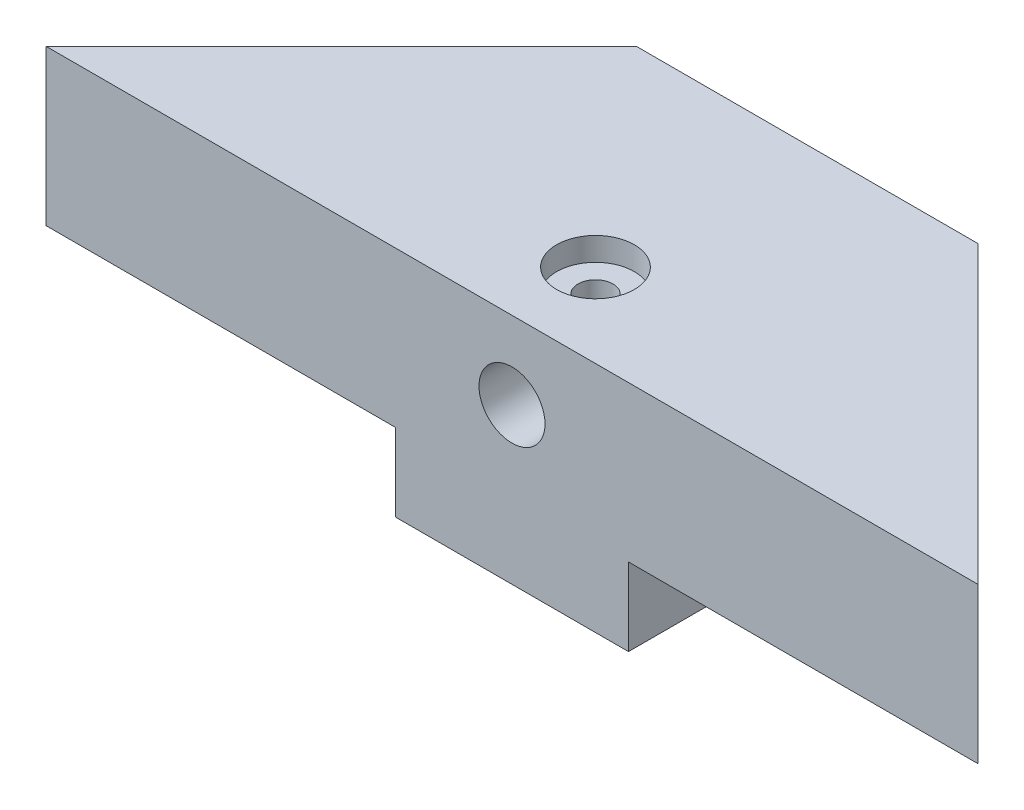
ISO-10303-21;
HEADER;
FILE_DESCRIPTION(('STEP AP214'),'2;1');
FILE_NAME('part.step','',(''),(''),'','','');
FILE_SCHEMA(('AUTOMOTIVE_DESIGN { 1 0 10303 214 1 1 1 1 }'));
ENDSEC;
DATA;
#1=APPLICATION_CONTEXT('core data for automotive mechanical design processes');
#2=APPLICATION_PROTOCOL_DEFINITION('international standard','automotive_design',2000,#1);
#3=PRODUCT_CONTEXT('',#1,'mechanical');
#4=PRODUCT('Part','Part','',(#3));
#5=PRODUCT_RELATED_PRODUCT_CATEGORY('part','',(#4));
#6=PRODUCT_DEFINITION_FORMATION('','',#4);
#7=PRODUCT_DEFINITION_CONTEXT('part definition',#1,'design');
#8=PRODUCT_DEFINITION('design','',#6,#7);
#9=PRODUCT_DEFINITION_SHAPE('','',#8);
#10=(LENGTH_UNIT() NAMED_UNIT(*) SI_UNIT(.MILLI.,.METRE.));
#11=(NAMED_UNIT(*) PLANE_ANGLE_UNIT() SI_UNIT($,.RADIAN.));
#12=(NAMED_UNIT(*) SI_UNIT($,.STERADIAN.) SOLID_ANGLE_UNIT());
#13=UNCERTAINTY_MEASURE_WITH_UNIT(LENGTH_MEASURE(1.E-05),#10,'distance_accuracy_value','');
#14=(GEOMETRIC_REPRESENTATION_CONTEXT(3) GLOBAL_UNCERTAINTY_ASSIGNED_CONTEXT((#13)) GLOBAL_UNIT_ASSIGNED_CONTEXT((#10,
#11,#12)) REPRESENTATION_CONTEXT('',''));
#15=CARTESIAN_POINT('',(0.,0.,0.));
#16=DIRECTION('',(0.,0.,1.));
#17=DIRECTION('',(1.,0.,0.));
#18=AXIS2_PLACEMENT_3D('',#15,#16,#17);
#19=CARTESIAN_POINT('',(0.,20.,0.));
#20=DIRECTION('',(0.,0.,-1.));
#21=DIRECTION('',(-1.,0.,0.));
#22=AXIS2_PLACEMENT_3D('',#19,#20,#21);
#23=PLANE('',#22);
#24=CARTESIAN_POINT('',(0.,10.,0.));
#25=DIRECTION('',(0.,0.,1.));
#26=DIRECTION('',(1.,0.,0.));
#27=AXIS2_PLACEMENT_3D('',#24,#25,#26);
#28=CIRCLE('',#27,4.25);
#29=CARTESIAN_POINT('',(4.25,10.,0.));
#30=VERTEX_POINT('',#29);
#31=EDGE_CURVE('E140',#30,#30,#28,.T.);
#32=ORIENTED_EDGE('',*,*,#31,.F.);
#33=EDGE_LOOP('',(#32));
#34=FACE_BOUND('',#33,.T.);
#35=DIRECTION('',(1.,0.,0.));
#36=VECTOR('',#35,1.);
#37=CARTESIAN_POINT('',(0.,0.,0.));
#38=LINE('',#37,#36);
#39=CARTESIAN_POINT('',(-60.,0.,0.));
#40=VERTEX_POINT('',#39);
#41=CARTESIAN_POINT('',(-15.,0.,0.));
#42=VERTEX_POINT('',#41);
#43=EDGE_CURVE('E164',#40,#42,#38,.T.);
#44=ORIENTED_EDGE('',*,*,#43,.T.);
#45=DIRECTION('',(0.,1.,0.));
#46=VECTOR('',#45,1.);
#47=CARTESIAN_POINT('',(-15.,-10.,0.));
#48=LINE('',#47,#46);
#49=CARTESIAN_POINT('',(-15.,-10.,0.));
#50=VERTEX_POINT('',#49);
#51=EDGE_CURVE('E213',#50,#42,#48,.T.);
#52=ORIENTED_EDGE('',*,*,#51,.F.);
#53=DIRECTION('',(-1.,0.,0.));
#54=VECTOR('',#53,1.);
#55=CARTESIAN_POINT('',(0.,-10.,0.));
#56=LINE('',#55,#54);
#57=CARTESIAN_POINT('',(15.,-10.,0.));
#58=VERTEX_POINT('',#57);
#59=EDGE_CURVE('E129',#58,#50,#56,.T.);
#60=ORIENTED_EDGE('',*,*,#59,.F.);
#61=DIRECTION('',(0.,1.,0.));
#62=VECTOR('',#61,1.);
#63=CARTESIAN_POINT('',(15.,-10.,0.));
#64=LINE('',#63,#62);
#65=CARTESIAN_POINT('',(15.,0.,0.));
#66=VERTEX_POINT('',#65);
#67=EDGE_CURVE('E142',#58,#66,#64,.T.);
#68=ORIENTED_EDGE('',*,*,#67,.T.);
#69=CARTESIAN_POINT('',(60.,0.,0.));
#70=VERTEX_POINT('',#69);
#71=EDGE_CURVE('E69',#66,#70,#38,.T.);
#72=ORIENTED_EDGE('',*,*,#71,.T.);
#73=DIRECTION('',(0.,-1.,0.));
#74=VECTOR('',#73,1.);
#75=CARTESIAN_POINT('',(60.,20.,0.));
#76=LINE('',#75,#74);
#77=CARTESIAN_POINT('',(60.,20.,0.));
#78=VERTEX_POINT('',#77);
#79=EDGE_CURVE('E11',#78,#70,#76,.T.);
#80=ORIENTED_EDGE('',*,*,#79,.F.);
#81=DIRECTION('',(1.,0.,0.));
#82=VECTOR('',#81,1.);
#83=CARTESIAN_POINT('',(0.,20.,0.));
#84=LINE('',#83,#82);
#85=CARTESIAN_POINT('',(-60.,20.,0.));
#86=VERTEX_POINT('',#85);
#87=EDGE_CURVE('E154',#86,#78,#84,.T.);
#88=ORIENTED_EDGE('',*,*,#87,.F.);
#89=DIRECTION('',(0.,-1.,0.));
#90=VECTOR('',#89,1.);
#91=CARTESIAN_POINT('',(-60.,20.,0.));
#92=LINE('',#91,#90);
#93=EDGE_CURVE('E163',#86,#40,#92,.T.);
#94=ORIENTED_EDGE('',*,*,#93,.T.);
#95=EDGE_LOOP('',(#44,#52,#60,#68,#72,#80,#88,#94));
#96=FACE_BOUND('',#95,.T.);
#97=ADVANCED_FACE('F43',(#34,#96),#23,.F.);
#98=CARTESIAN_POINT('',(22.,20.,-38.));
#99=DIRECTION('',(-0.707106781186548,0.,0.707106781186548));
#100=DIRECTION('',(0.707106781186548,0.,0.707106781186548));
#101=AXIS2_PLACEMENT_3D('',#98,#99,#100);
#102=PLANE('',#101);
#103=DIRECTION('',(-0.707106781186548,0.,-0.707106781186548));
#104=VECTOR('',#103,1.);
#105=CARTESIAN_POINT('',(22.,0.,-38.));
#106=LINE('',#105,#104);
#107=CARTESIAN_POINT('',(22.,0.,-38.));
#108=VERTEX_POINT('',#107);
#109=EDGE_CURVE('E169',#70,#108,#106,.T.);
#110=ORIENTED_EDGE('',*,*,#109,.T.);
#111=DIRECTION('',(0.,-1.,0.));
#112=VECTOR('',#111,1.);
#113=CARTESIAN_POINT('',(22.,20.,-38.));
#114=LINE('',#113,#112);
#115=CARTESIAN_POINT('',(22.,20.,-38.));
#116=VERTEX_POINT('',#115);
#117=EDGE_CURVE('E57',#116,#108,#114,.T.);
#118=ORIENTED_EDGE('',*,*,#117,.F.);
#119=DIRECTION('',(-0.707106781186548,0.,-0.707106781186548));
#120=VECTOR('',#119,1.);
#121=CARTESIAN_POINT('',(22.,20.,-38.));
#122=LINE('',#121,#120);
#123=EDGE_CURVE('E160',#78,#116,#122,.T.);
#124=ORIENTED_EDGE('',*,*,#123,.F.);
#125=ORIENTED_EDGE('',*,*,#79,.T.);
#126=EDGE_LOOP('',(#110,#118,#124,#125));
#127=FACE_BOUND('',#126,.T.);
#128=ADVANCED_FACE('F204',(#127),#102,.F.);
#129=CARTESIAN_POINT('',(0.,20.,-38.));
#130=DIRECTION('',(0.,0.,1.));
#131=DIRECTION('',(1.,0.,0.));
#132=AXIS2_PLACEMENT_3D('',#129,#130,#131);
#133=PLANE('',#132);
#134=DIRECTION('',(-1.,0.,0.));
#135=VECTOR('',#134,1.);
#136=CARTESIAN_POINT('',(0.,0.,-38.));
#137=LINE('',#136,#135);
#138=CARTESIAN_POINT('',(-22.,0.,-38.));
#139=VERTEX_POINT('',#138);
#140=EDGE_CURVE('E173',#108,#139,#137,.T.);
#141=ORIENTED_EDGE('',*,*,#140,.T.);
#142=DIRECTION('',(0.,-1.,0.));
#143=VECTOR('',#142,1.);
#144=CARTESIAN_POINT('',(-22.,20.,-38.));
#145=LINE('',#144,#143);
#146=CARTESIAN_POINT('',(-22.,20.,-38.));
#147=VERTEX_POINT('',#146);
#148=EDGE_CURVE('E180',#147,#139,#145,.T.);
#149=ORIENTED_EDGE('',*,*,#148,.F.);
#150=DIRECTION('',(-1.,0.,0.));
#151=VECTOR('',#150,1.);
#152=CARTESIAN_POINT('',(0.,20.,-38.));
#153=LINE('',#152,#151);
#154=EDGE_CURVE('E159',#116,#147,#153,.T.);
#155=ORIENTED_EDGE('',*,*,#154,.F.);
#156=ORIENTED_EDGE('',*,*,#117,.T.);
#157=EDGE_LOOP('',(#141,#149,#155,#156));
#158=FACE_BOUND('',#157,.T.);
#159=ADVANCED_FACE('F207',(#158),#133,.F.);
#160=CARTESIAN_POINT('',(-60.,20.,0.));
#161=DIRECTION('',(0.707106781186548,0.,0.707106781186548));
#162=DIRECTION('',(0.707106781186548,0.,-0.707106781186548));
#163=AXIS2_PLACEMENT_3D('',#160,#161,#162);
#164=PLANE('',#163);
#165=DIRECTION('',(-0.707106781186548,0.,0.707106781186548));
#166=VECTOR('',#165,1.);
#167=CARTESIAN_POINT('',(-60.,0.,0.));
#168=LINE('',#167,#166);
#169=EDGE_CURVE('E158',#139,#40,#168,.T.);
#170=ORIENTED_EDGE('',*,*,#169,.T.);
#171=ORIENTED_EDGE('',*,*,#93,.F.);
#172=DIRECTION('',(-0.707106781186548,0.,0.707106781186548));
#173=VECTOR('',#172,1.);
#174=CARTESIAN_POINT('',(-60.,20.,0.));
#175=LINE('',#174,#173);
#176=EDGE_CURVE('E165',#147,#86,#175,.T.);
#177=ORIENTED_EDGE('',*,*,#176,.F.);
#178=ORIENTED_EDGE('',*,*,#148,.T.);
#179=EDGE_LOOP('',(#170,#171,#177,#178));
#180=FACE_BOUND('',#179,.T.);
#181=ADVANCED_FACE('F392',(#180),#164,.F.);
#182=CARTESIAN_POINT('',(0.,20.,0.));
#183=DIRECTION('',(0.,-1.,0.));
#184=DIRECTION('',(0.,0.,-1.));
#185=AXIS2_PLACEMENT_3D('',#182,#183,#184);
#186=PLANE('',#185);
#187=CARTESIAN_POINT('',(0.,20.,-10.75));
#188=DIRECTION('',(0.,1.,0.));
#189=DIRECTION('',(0.,0.,1.));
#190=AXIS2_PLACEMENT_3D('',#187,#188,#189);
#191=CIRCLE('',#190,5.);
#192=CARTESIAN_POINT('',(0.,20.,-5.75));
#193=VERTEX_POINT('',#192);
#194=EDGE_CURVE('E151',#193,#193,#191,.T.);
#195=ORIENTED_EDGE('',*,*,#194,.F.);
#196=EDGE_LOOP('',(#195));
#197=FACE_BOUND('',#196,.T.);
#198=ORIENTED_EDGE('',*,*,#87,.T.);
#199=ORIENTED_EDGE('',*,*,#123,.T.);
#200=ORIENTED_EDGE('',*,*,#154,.T.);
#201=ORIENTED_EDGE('',*,*,#176,.T.);
#202=EDGE_LOOP('',(#198,#199,#200,#201));
#203=FACE_BOUND('',#202,.T.);
#204=ADVANCED_FACE('F384',(#197,#203),#186,.F.);
#205=CARTESIAN_POINT('',(0.,0.,0.));
#206=DIRECTION('',(0.,-1.,0.));
#207=DIRECTION('',(0.,0.,-1.));
#208=AXIS2_PLACEMENT_3D('',#205,#206,#207);
#209=PLANE('',#208);
#210=DIRECTION('',(0.,0.,-1.));
#211=VECTOR('',#210,1.);
#212=CARTESIAN_POINT('',(-15.,0.,0.));
#213=LINE('',#212,#211);
#214=CARTESIAN_POINT('',(-15.,0.,-25.));
#215=VERTEX_POINT('',#214);
#216=EDGE_CURVE('E136',#42,#215,#213,.T.);
#217=ORIENTED_EDGE('',*,*,#216,.F.);
#218=ORIENTED_EDGE('',*,*,#43,.F.);
#219=ORIENTED_EDGE('',*,*,#169,.F.);
#220=ORIENTED_EDGE('',*,*,#140,.F.);
#221=ORIENTED_EDGE('',*,*,#109,.F.);
#222=ORIENTED_EDGE('',*,*,#71,.F.);
#223=DIRECTION('',(0.,0.,-1.));
#224=VECTOR('',#223,1.);
#225=CARTESIAN_POINT('',(15.,0.,0.));
#226=LINE('',#225,#224);
#227=CARTESIAN_POINT('',(15.,0.,-25.));
#228=VERTEX_POINT('',#227);
#229=EDGE_CURVE('E132',#66,#228,#226,.T.);
#230=ORIENTED_EDGE('',*,*,#229,.T.);
#231=DIRECTION('',(1.,0.,0.));
#232=VECTOR('',#231,1.);
#233=CARTESIAN_POINT('',(0.,0.,-25.));
#234=LINE('',#233,#232);
#235=EDGE_CURVE('E65',#215,#228,#234,.T.);
#236=ORIENTED_EDGE('',*,*,#235,.F.);
#237=EDGE_LOOP('',(#217,#218,#219,#220,#221,#222,#230,#236));
#238=FACE_BOUND('',#237,.T.);
#239=ADVANCED_FACE('F374',(#238),#209,.T.);
#240=CARTESIAN_POINT('',(0.,17.,-10.75));
#241=DIRECTION('',(0.,1.,0.));
#242=DIRECTION('',(0.,0.,1.));
#243=AXIS2_PLACEMENT_3D('',#240,#241,#242);
#244=CYLINDRICAL_SURFACE('',#243,5.);
#245=CARTESIAN_POINT('',(0.,17.,-10.75));
#246=DIRECTION('',(0.,1.,0.));
#247=DIRECTION('',(0.,0.,1.));
#248=AXIS2_PLACEMENT_3D('',#245,#246,#247);
#249=CIRCLE('',#248,5.);
#250=CARTESIAN_POINT('',(0.,17.,-5.75));
#251=VERTEX_POINT('',#250);
#252=EDGE_CURVE('E146',#251,#251,#249,.T.);
#253=ORIENTED_EDGE('',*,*,#252,.F.);
#254=EDGE_LOOP('',(#253));
#255=FACE_BOUND('',#254,.T.);
#256=ORIENTED_EDGE('',*,*,#194,.T.);
#257=EDGE_LOOP('',(#256));
#258=FACE_BOUND('',#257,.T.);
#259=ADVANCED_FACE('F364',(#255,#258),#244,.F.);
#260=CARTESIAN_POINT('',(0.,17.,-10.75));
#261=DIRECTION('',(0.,1.,0.));
#262=DIRECTION('',(0.,0.,1.));
#263=AXIS2_PLACEMENT_3D('',#260,#261,#262);
#264=PLANE('',#263);
#265=CARTESIAN_POINT('',(0.,17.,-10.75));
#266=DIRECTION('',(0.,1.,0.));
#267=DIRECTION('',(0.,0.,1.));
#268=AXIS2_PLACEMENT_3D('',#265,#266,#267);
#269=CIRCLE('',#268,2.25);
#270=CARTESIAN_POINT('',(0.,17.,-8.5));
#271=VERTEX_POINT('',#270);
#272=EDGE_CURVE('E152',#271,#271,#269,.T.);
#273=ORIENTED_EDGE('',*,*,#272,.F.);
#274=EDGE_LOOP('',(#273));
#275=FACE_BOUND('',#274,.T.);
#276=ORIENTED_EDGE('',*,*,#252,.T.);
#277=EDGE_LOOP('',(#276));
#278=FACE_BOUND('',#277,.T.);
#279=ADVANCED_FACE('F199',(#275,#278),#264,.T.);
#280=CARTESIAN_POINT('',(0.,10.,-10.75));
#281=DIRECTION('',(0.,1.,0.));
#282=DIRECTION('',(0.,0.,1.));
#283=AXIS2_PLACEMENT_3D('',#280,#281,#282);
#284=CYLINDRICAL_SURFACE('',#283,2.25);
#285=CARTESIAN_POINT('',(0.,14.25,-8.5));
#286=CARTESIAN_POINT('',(-0.11743312908732,14.249992080781,-8.50000913516209));
#287=CARTESIAN_POINT('',(-0.234986111926386,14.2450814710196,-8.50924819489414));
#288=CARTESIAN_POINT('',(-0.466561190267593,14.2259179717321,-8.54577356904425));
#289=CARTESIAN_POINT('',(-0.580577364057518,14.2116502155191,-8.57308860329808));
#290=CARTESIAN_POINT('',(-0.801390898811922,14.1752540938183,-8.64436963603458));
#291=CARTESIAN_POINT('',(-0.90821533293503,14.1531574270824,-8.68826853432449));
#292=CARTESIAN_POINT('',(-1.11279345964767,14.1030840580569,-8.7910942698865));
#293=CARTESIAN_POINT('',(-1.21054719615045,14.0751073842358,-8.85002103440019));
#294=CARTESIAN_POINT('',(-1.4014032336789,14.0136351181657,-8.98558676105482));
#295=CARTESIAN_POINT('',(-1.49378239999522,13.9798981617393,-9.0631325333375));
#296=CARTESIAN_POINT('',(-1.66490218848395,13.9114079215203,-9.23176033935962));
#297=CARTESIAN_POINT('',(-1.74363105544601,13.8766537915737,-9.32285391587676));
#298=CARTESIAN_POINT('',(-1.89231554427111,13.8064407476919,-9.52572994210797));
#299=CARTESIAN_POINT('',(-1.96085456877203,13.7711973267784,-9.63863450807416));
#300=CARTESIAN_POINT('',(-2.07769156223872,13.7081171540182,-9.87638559315655));
#301=CARTESIAN_POINT('',(-2.12600506199464,13.6802747251119,-10.0012228585635));
#302=CARTESIAN_POINT('',(-2.19768609472387,13.6379011795902,-10.2514732694413));
#303=CARTESIAN_POINT('',(-2.22242014170115,13.622648885295,-10.376366094051));
#304=CARTESIAN_POINT('',(-2.25035436907479,13.6053721504466,-10.6293786221177));
#305=CARTESIAN_POINT('',(-2.25358096293418,13.6033314846827,-10.7574941734506));
#306=CARTESIAN_POINT('',(-2.23940611628039,13.6121436176894,-10.9942302178476));
#307=CARTESIAN_POINT('',(-2.22479183473222,13.6212547704302,-11.1030996378073));
#308=CARTESIAN_POINT('',(-2.18023817462736,13.6482507587857,-11.3165256227204));
#309=CARTESIAN_POINT('',(-2.15029280410453,13.6661390247124,-11.421080484104));
#310=CARTESIAN_POINT('',(-2.07545573561311,13.7090253456453,-11.6258699943891));
#311=CARTESIAN_POINT('',(-2.03024117131174,13.7341751187534,-11.7259533549008));
#312=CARTESIAN_POINT('',(-1.92641236422635,13.7887825973532,-11.917616753703));
#313=CARTESIAN_POINT('',(-1.86779215918212,13.8182422175753,-12.0091929828212));
#314=CARTESIAN_POINT('',(-1.72896659265729,13.8832790663403,-12.1951683318004));
#315=CARTESIAN_POINT('',(-1.64686635857351,13.9191252567915,-12.2880641302834));
#316=CARTESIAN_POINT('',(-1.46821347224303,13.9894952086347,-12.4594391654882));
#317=CARTESIAN_POINT('',(-1.37165230242525,14.0240181754879,-12.5379098446494));
#318=CARTESIAN_POINT('',(-1.15981033607945,14.0902737663842,-12.6825400206588));
#319=CARTESIAN_POINT('',(-1.04376950920103,14.1217292055375,-12.7477239843832));
#320=CARTESIAN_POINT('',(-0.800292376239016,14.1758268113177,-12.8570824461279));
#321=CARTESIAN_POINT('',(-0.672866228884885,14.198476740103,-12.9012754555724));
#322=CARTESIAN_POINT('',(-0.422388236357608,14.2306723633851,-12.9634194611586));
#323=CARTESIAN_POINT('',(-0.299958050383825,14.2412057315285,-12.9833575779371));
#324=CARTESIAN_POINT('',(-0.0530603264747718,14.2514604023563,-13.0027741690786));
#325=CARTESIAN_POINT('',(0.0714060208752491,14.2511878124739,-13.002264200519));
#326=CARTESIAN_POINT('',(0.30700932725922,14.2403913223145,-12.9818097589738));
#327=CARTESIAN_POINT('',(0.418345859111028,14.2307829324414,-12.9636008628274));
#328=CARTESIAN_POINT('',(0.636120390655569,14.2035576422404,-12.9111106624021));
#329=CARTESIAN_POINT('',(0.742557876067867,14.1859399032283,-12.8768276749422));
#330=CARTESIAN_POINT('',(0.950705814023631,14.1436978888456,-12.7924488162505));
#331=CARTESIAN_POINT('',(1.05222699121256,14.1189066885799,-12.7419726671778));
#332=CARTESIAN_POINT('',(1.24565725340794,14.0645967183493,-12.6271006080589));
#333=CARTESIAN_POINT('',(1.33756251575117,14.0350760799821,-12.5626991931952));
#334=CARTESIAN_POINT('',(1.51957303762813,13.9703515317203,-12.4139253314653));
#335=CARTESIAN_POINT('',(1.60844155473139,13.9348772586568,-12.328155658705));
#336=CARTESIAN_POINT('',(1.77115263226334,13.8643754720389,-12.1430971337073));
#337=CARTESIAN_POINT('',(1.84498169008931,13.8293483861851,-12.043796265308));
#338=CARTESIAN_POINT('',(1.98015639060834,13.7613262753104,-11.8265164263683));
#339=CARTESIAN_POINT('',(2.04037951782744,13.7286110748813,-11.7077431434929));
#340=CARTESIAN_POINT('',(2.13936309725451,13.6727233694215,-11.4595156323046));
#341=CARTESIAN_POINT('',(2.17815385922214,13.6495374000597,-11.3300767867258));
#342=CARTESIAN_POINT('',(2.22936499596692,13.6184598643226,-11.0776425482372));
#343=CARTESIAN_POINT('',(2.24399649407357,13.6092924843021,-10.9552581943633));
#344=CARTESIAN_POINT('',(2.25298684243818,13.6036917005573,-10.7094867712816));
#345=CARTESIAN_POINT('',(2.24735878748389,13.607250071518,-10.586100401174));
#346=CARTESIAN_POINT('',(2.21811234132368,13.6252862746363,-10.3573307233342));
#347=CARTESIAN_POINT('',(2.19670031968296,13.6384229319273,-10.2515440549855));
#348=CARTESIAN_POINT('',(2.13946092533258,13.6723708452681,-10.0452495365253));
#349=CARTESIAN_POINT('',(2.10362831730275,13.6931848883243,-9.94474361856125));
#350=CARTESIAN_POINT('',(2.01601429222087,13.7417699214274,-9.74456783946849));
#351=CARTESIAN_POINT('',(1.96334782301553,13.7699050879737,-9.64537667927841));
#352=CARTESIAN_POINT('',(1.84445551533722,13.8294786855678,-9.45657541619809));
#353=CARTESIAN_POINT('',(1.77822237488762,13.8609188910289,-9.36697051261255));
#354=CARTESIAN_POINT('',(1.62309644325611,13.9288918476479,-9.18662904740093));
#355=CARTESIAN_POINT('',(1.53232214484545,13.9655144133108,-9.0975345665425));
#356=CARTESIAN_POINT('',(1.3363389290462,14.0357844603369,-8.93536525220341));
#357=CARTESIAN_POINT('',(1.23112095269526,14.0694300526125,-8.86230054779231));
#358=CARTESIAN_POINT('',(1.0057636767119,14.1309571607031,-8.73304165393508));
#359=CARTESIAN_POINT('',(0.885347584473011,14.1586959699206,-8.67725290458967));
#360=CARTESIAN_POINT('',(0.697807326943737,14.1928069683143,-8.60990887999905));
#361=CARTESIAN_POINT('',(0.634183081450046,14.2029237850316,-8.59019127478643));
#362=CARTESIAN_POINT('',(0.505091382511691,14.2203804188116,-8.55641307282964));
#363=CARTESIAN_POINT('',(0.439624986033926,14.227721794781,-8.54234930016482));
#364=CARTESIAN_POINT('',(0.312006058317935,14.2389819151814,-8.52086445594123));
#365=CARTESIAN_POINT('',(0.249937073625234,14.2431020866858,-8.51305157063727));
#366=CARTESIAN_POINT('',(0.125256767522785,14.2486132631186,-8.50261686470153));
#367=CARTESIAN_POINT('',(0.0626454374867374,14.2500042245569,-8.49999512679062));
#368=CARTESIAN_POINT('',(0.,14.25,-8.5));
#369=B_SPLINE_CURVE_WITH_KNOTS('',3,(#285,#286,#287,#288,#289,#290,#291,#292,#293,#294,#295,
#296,#297,#298,#299,#300,#301,#302,#303,#304,#305,#306,#307,#308,#309,#310,#311,#312,#313,#314,
#315,#316,#317,#318,#319,#320,#321,#322,#323,#324,#325,#326,#327,#328,#329,#330,#331,#332,#333,
#334,#335,#336,#337,#338,#339,#340,#341,#342,#343,#344,#345,#346,#347,#348,#349,#350,#351,#352,
#353,#354,#355,#356,#357,#358,#359,#360,#361,#362,#363,#364,#365,#366,#367,#368),.UNSPECIFIED.,
.T.,.F.,(4,2,2,2,2,2,2,2,2,2,2,2,2,2,2,2,2,2,2,2,2,2,2,2,2,2,2,2,2,2,2,2,2,2,2,2,2,2,2,2,2,4),
(0.,0.35205626546178,0.70467323940706,1.05587850603446,1.40708207231083,1.78127091220175,
2.15578040833956,2.56382085279585,2.97154739358102,3.35387474719432,3.73573247509524,
4.06485635196564,4.39410896113577,4.73081174463817,5.06766457150167,5.45317972911658,
5.83892285692041,6.24699419800421,6.65470499942765,7.0260932710837,7.39727164032407,
7.73537965265236,8.07352307750466,8.42027333719465,8.76716092267199,9.15103468781875,
9.53525159491836,9.94442808253383,10.3530244197976,10.7215919906177,11.0899213801084,
11.4146898170589,11.7395762660466,12.0855737835934,12.4317580187172,12.8270431901501,
13.2225774238327,13.6267922458768,13.8286478603905,14.0303899278193,14.2181935528093,
14.406000170424),.UNSPECIFIED.);
#370=CARTESIAN_POINT('',(0.,14.25,-8.5));
#371=VERTEX_POINT('',#370);
#372=EDGE_CURVE('E46',#371,#371,#369,.T.);
#373=ORIENTED_EDGE('',*,*,#372,.T.);
#374=EDGE_LOOP('',(#373));
#375=FACE_BOUND('',#374,.T.);
#376=ORIENTED_EDGE('',*,*,#272,.T.);
#377=EDGE_LOOP('',(#376));
#378=FACE_BOUND('',#377,.T.);
#379=ADVANCED_FACE('F189',(#375,#378),#284,.F.);
#380=CARTESIAN_POINT('',(0.,10.,-20.));
#381=DIRECTION('',(0.,0.,1.));
#382=DIRECTION('',(1.,0.,0.));
#383=AXIS2_PLACEMENT_3D('',#380,#381,#382);
#384=CYLINDRICAL_SURFACE('',#383,4.25);
#385=ORIENTED_EDGE('',*,*,#31,.T.);
#386=EDGE_LOOP('',(#385));
#387=FACE_BOUND('',#386,.T.);
#388=CARTESIAN_POINT('',(0.,10.,-20.));
#389=DIRECTION('',(0.,0.,1.));
#390=DIRECTION('',(1.,0.,0.));
#391=AXIS2_PLACEMENT_3D('',#388,#389,#390);
#392=CIRCLE('',#391,4.25);
#393=CARTESIAN_POINT('',(4.25,10.,-20.));
#394=VERTEX_POINT('',#393);
#395=EDGE_CURVE('E139',#394,#394,#392,.T.);
#396=ORIENTED_EDGE('',*,*,#395,.F.);
#397=EDGE_LOOP('',(#396));
#398=FACE_BOUND('',#397,.T.);
#399=ORIENTED_EDGE('',*,*,#372,.F.);
#400=EDGE_LOOP('',(#399));
#401=FACE_BOUND('',#400,.T.);
#402=ADVANCED_FACE('F190',(#387,#398,#401),#384,.F.);
#403=CARTESIAN_POINT('',(0.,10.,-20.));
#404=DIRECTION('',(0.,0.,1.));
#405=DIRECTION('',(1.,0.,0.));
#406=AXIS2_PLACEMENT_3D('',#403,#404,#405);
#407=PLANE('',#406);
#408=ORIENTED_EDGE('',*,*,#395,.T.);
#409=EDGE_LOOP('',(#408));
#410=FACE_BOUND('',#409,.T.);
#411=ADVANCED_FACE('F191',(#410),#407,.T.);
#412=CARTESIAN_POINT('',(-15.,-10.,0.));
#413=DIRECTION('',(1.,0.,0.));
#414=DIRECTION('',(0.,0.,-1.));
#415=AXIS2_PLACEMENT_3D('',#412,#413,#414);
#416=PLANE('',#415);
#417=ORIENTED_EDGE('',*,*,#216,.T.);
#418=DIRECTION('',(0.,1.,0.));
#419=VECTOR('',#418,1.);
#420=CARTESIAN_POINT('',(-15.,-10.,-25.));
#421=LINE('',#420,#419);
#422=CARTESIAN_POINT('',(-15.,-10.,-25.));
#423=VERTEX_POINT('',#422);
#424=EDGE_CURVE('E118',#423,#215,#421,.T.);
#425=ORIENTED_EDGE('',*,*,#424,.F.);
#426=DIRECTION('',(0.,0.,-1.));
#427=VECTOR('',#426,1.);
#428=CARTESIAN_POINT('',(-15.,-10.,0.));
#429=LINE('',#428,#427);
#430=EDGE_CURVE('E122',#50,#423,#429,.T.);
#431=ORIENTED_EDGE('',*,*,#430,.F.);
#432=ORIENTED_EDGE('',*,*,#51,.T.);
#433=EDGE_LOOP('',(#417,#425,#431,#432));
#434=FACE_BOUND('',#433,.T.);
#435=ADVANCED_FACE('F131',(#434),#416,.F.);
#436=CARTESIAN_POINT('',(0.,-10.,-25.));
#437=DIRECTION('',(0.,0.,1.));
#438=DIRECTION('',(1.,0.,0.));
#439=AXIS2_PLACEMENT_3D('',#436,#437,#438);
#440=PLANE('',#439);
#441=ORIENTED_EDGE('',*,*,#235,.T.);
#442=DIRECTION('',(0.,1.,0.));
#443=VECTOR('',#442,1.);
#444=CARTESIAN_POINT('',(15.,-10.,-25.));
#445=LINE('',#444,#443);
#446=CARTESIAN_POINT('',(15.,-10.,-25.));
#447=VERTEX_POINT('',#446);
#448=EDGE_CURVE('E120',#447,#228,#445,.T.);
#449=ORIENTED_EDGE('',*,*,#448,.F.);
#450=DIRECTION('',(1.,0.,0.));
#451=VECTOR('',#450,1.);
#452=CARTESIAN_POINT('',(0.,-10.,-25.));
#453=LINE('',#452,#451);
#454=EDGE_CURVE('E115',#423,#447,#453,.T.);
#455=ORIENTED_EDGE('',*,*,#454,.F.);
#456=ORIENTED_EDGE('',*,*,#424,.T.);
#457=EDGE_LOOP('',(#441,#449,#455,#456));
#458=FACE_BOUND('',#457,.T.);
#459=ADVANCED_FACE('F111',(#458),#440,.F.);
#460=CARTESIAN_POINT('',(15.,-10.,0.));
#461=DIRECTION('',(1.,0.,0.));
#462=DIRECTION('',(0.,0.,-1.));
#463=AXIS2_PLACEMENT_3D('',#460,#461,#462);
#464=PLANE('',#463);
#465=ORIENTED_EDGE('',*,*,#229,.F.);
#466=ORIENTED_EDGE('',*,*,#67,.F.);
#467=DIRECTION('',(0.,0.,-1.));
#468=VECTOR('',#467,1.);
#469=CARTESIAN_POINT('',(15.,-10.,0.));
#470=LINE('',#469,#468);
#471=EDGE_CURVE('E123',#58,#447,#470,.T.);
#472=ORIENTED_EDGE('',*,*,#471,.T.);
#473=ORIENTED_EDGE('',*,*,#448,.T.);
#474=EDGE_LOOP('',(#465,#466,#472,#473));
#475=FACE_BOUND('',#474,.T.);
#476=ADVANCED_FACE('F247',(#475),#464,.T.);
#477=CARTESIAN_POINT('',(0.,-10.,0.));
#478=DIRECTION('',(0.,-1.,0.));
#479=DIRECTION('',(0.,0.,-1.));
#480=AXIS2_PLACEMENT_3D('',#477,#478,#479);
#481=PLANE('',#480);
#482=CARTESIAN_POINT('',(-7.5,-10.,-12.5));
#483=DIRECTION('',(0.,-1.,0.));
#484=DIRECTION('',(0.,0.,-1.));
#485=AXIS2_PLACEMENT_3D('',#482,#483,#484);
#486=CIRCLE('',#485,2.25);
#487=CARTESIAN_POINT('',(-7.5,-10.,-14.75));
#488=VERTEX_POINT('',#487);
#489=EDGE_CURVE('E231',#488,#488,#486,.T.);
#490=ORIENTED_EDGE('',*,*,#489,.F.);
#491=EDGE_LOOP('',(#490));
#492=FACE_BOUND('',#491,.T.);
#493=CARTESIAN_POINT('',(7.5,-10.,-12.5));
#494=DIRECTION('',(0.,-1.,0.));
#495=DIRECTION('',(0.,0.,-1.));
#496=AXIS2_PLACEMENT_3D('',#493,#494,#495);
#497=CIRCLE('',#496,2.25);
#498=CARTESIAN_POINT('',(7.5,-10.,-14.75));
#499=VERTEX_POINT('',#498);
#500=EDGE_CURVE('E227',#499,#499,#497,.T.);
#501=ORIENTED_EDGE('',*,*,#500,.F.);
#502=EDGE_LOOP('',(#501));
#503=FACE_BOUND('',#502,.T.);
#504=ORIENTED_EDGE('',*,*,#430,.T.);
#505=ORIENTED_EDGE('',*,*,#454,.T.);
#506=ORIENTED_EDGE('',*,*,#471,.F.);
#507=ORIENTED_EDGE('',*,*,#59,.T.);
#508=EDGE_LOOP('',(#504,#505,#506,#507));
#509=FACE_BOUND('',#508,.T.);
#510=ADVANCED_FACE('F130',(#492,#503,#509),#481,.T.);
#511=CARTESIAN_POINT('',(7.5,0.,-12.5));
#512=DIRECTION('',(0.,-1.,0.));
#513=DIRECTION('',(0.,0.,-1.));
#514=AXIS2_PLACEMENT_3D('',#511,#512,#513);
#515=CYLINDRICAL_SURFACE('',#514,2.25);
#516=CARTESIAN_POINT('',(7.5,0.,-12.5));
#517=DIRECTION('',(0.,-1.,0.));
#518=DIRECTION('',(0.,0.,-1.));
#519=AXIS2_PLACEMENT_3D('',#516,#517,#518);
#520=CIRCLE('',#519,2.25);
#521=CARTESIAN_POINT('',(7.5,0.,-14.75));
#522=VERTEX_POINT('',#521);
#523=EDGE_CURVE('E223',#522,#522,#520,.T.);
#524=ORIENTED_EDGE('',*,*,#523,.F.);
#525=EDGE_LOOP('',(#524));
#526=FACE_BOUND('',#525,.T.);
#527=ORIENTED_EDGE('',*,*,#500,.T.);
#528=EDGE_LOOP('',(#527));
#529=FACE_BOUND('',#528,.T.);
#530=ADVANCED_FACE('F248',(#526,#529),#515,.F.);
#531=CARTESIAN_POINT('',(7.5,0.,-12.5));
#532=DIRECTION('',(0.,-1.,0.));
#533=DIRECTION('',(0.,0.,-1.));
#534=AXIS2_PLACEMENT_3D('',#531,#532,#533);
#535=PLANE('',#534);
#536=ORIENTED_EDGE('',*,*,#523,.T.);
#537=EDGE_LOOP('',(#536));
#538=FACE_BOUND('',#537,.T.);
#539=ADVANCED_FACE('F244',(#538),#535,.T.);
#540=CARTESIAN_POINT('',(-7.5,0.,-12.5));
#541=DIRECTION('',(0.,-1.,0.));
#542=DIRECTION('',(0.,0.,-1.));
#543=AXIS2_PLACEMENT_3D('',#540,#541,#542);
#544=CYLINDRICAL_SURFACE('',#543,2.25);
#545=CARTESIAN_POINT('',(-7.5,0.,-12.5));
#546=DIRECTION('',(0.,-1.,0.));
#547=DIRECTION('',(0.,0.,-1.));
#548=AXIS2_PLACEMENT_3D('',#545,#546,#547);
#549=CIRCLE('',#548,2.25);
#550=CARTESIAN_POINT('',(-7.5,0.,-14.75));
#551=VERTEX_POINT('',#550);
#552=EDGE_CURVE('E225',#551,#551,#549,.T.);
#553=ORIENTED_EDGE('',*,*,#552,.F.);
#554=EDGE_LOOP('',(#553));
#555=FACE_BOUND('',#554,.T.);
#556=ORIENTED_EDGE('',*,*,#489,.T.);
#557=EDGE_LOOP('',(#556));
#558=FACE_BOUND('',#557,.T.);
#559=ADVANCED_FACE('F239',(#555,#558),#544,.F.);
#560=CARTESIAN_POINT('',(-7.5,0.,-12.5));
#561=DIRECTION('',(0.,-1.,0.));
#562=DIRECTION('',(0.,0.,-1.));
#563=AXIS2_PLACEMENT_3D('',#560,#561,#562);
#564=PLANE('',#563);
#565=ORIENTED_EDGE('',*,*,#552,.T.);
#566=EDGE_LOOP('',(#565));
#567=FACE_BOUND('',#566,.T.);
#568=ADVANCED_FACE('F240',(#567),#564,.T.);
#569=CLOSED_SHELL('',(#97,#128,#159,#181,#204,#239,#259,#279,#379,#402,#411,#435,#459,#476,#510,
#530,#539,#559,#568));
#570=MANIFOLD_SOLID_BREP('B2',#569);
#571=ADVANCED_BREP_SHAPE_REPRESENTATION('',(#18,#570),#14);
#572=SHAPE_DEFINITION_REPRESENTATION(#9,#571);
ENDSEC;
END-ISO-10303-21;
